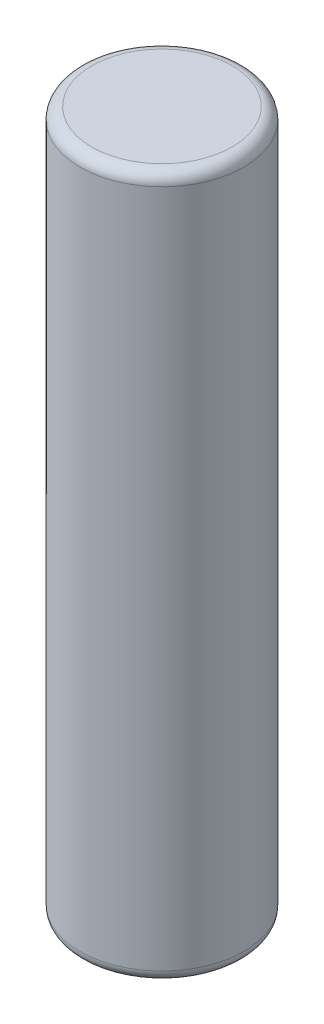
ISO-10303-21;
HEADER;
FILE_DESCRIPTION(('STEP AP214'),'2;1');
FILE_NAME('part.step','',(''),(''),'','','');
FILE_SCHEMA(('AUTOMOTIVE_DESIGN { 1 0 10303 214 1 1 1 1 }'));
ENDSEC;
DATA;
#1=APPLICATION_CONTEXT('core data for automotive mechanical design processes');
#2=APPLICATION_PROTOCOL_DEFINITION('international standard','automotive_design',2000,#1);
#3=PRODUCT_CONTEXT('',#1,'mechanical');
#4=PRODUCT('Part','Part','',(#3));
#5=PRODUCT_RELATED_PRODUCT_CATEGORY('part','',(#4));
#6=PRODUCT_DEFINITION_FORMATION('','',#4);
#7=PRODUCT_DEFINITION_CONTEXT('part definition',#1,'design');
#8=PRODUCT_DEFINITION('design','',#6,#7);
#9=PRODUCT_DEFINITION_SHAPE('','',#8);
#10=(LENGTH_UNIT() NAMED_UNIT(*) SI_UNIT(.MILLI.,.METRE.));
#11=(NAMED_UNIT(*) PLANE_ANGLE_UNIT() SI_UNIT($,.RADIAN.));
#12=(NAMED_UNIT(*) SI_UNIT($,.STERADIAN.) SOLID_ANGLE_UNIT());
#13=UNCERTAINTY_MEASURE_WITH_UNIT(LENGTH_MEASURE(1.E-05),#10,'distance_accuracy_value','');
#14=(GEOMETRIC_REPRESENTATION_CONTEXT(3) GLOBAL_UNCERTAINTY_ASSIGNED_CONTEXT((#13)) GLOBAL_UNIT_ASSIGNED_CONTEXT((#10,
#11,#12)) REPRESENTATION_CONTEXT('',''));
#15=CARTESIAN_POINT('',(0.,0.,0.));
#16=DIRECTION('',(0.,0.,1.));
#17=DIRECTION('',(1.,0.,0.));
#18=AXIS2_PLACEMENT_3D('',#15,#16,#17);
#19=CARTESIAN_POINT('',(0.,60.,0.));
#20=DIRECTION('',(0.,-1.,0.));
#21=DIRECTION('',(0.,0.,-1.));
#22=AXIS2_PLACEMENT_3D('',#19,#20,#21);
#23=CYLINDRICAL_SURFACE('',#22,7.00000000000001);
#24=CARTESIAN_POINT('',(0.,59.,0.));
#25=DIRECTION('',(0.,1.,0.));
#26=DIRECTION('',(0.,0.,1.));
#27=AXIS2_PLACEMENT_3D('',#24,#25,#26);
#28=CIRCLE('',#27,7.00000000000001);
#29=CARTESIAN_POINT('',(0.,59.,7.00000000000001));
#30=VERTEX_POINT('',#29);
#31=EDGE_CURVE('E45',#30,#30,#28,.F.);
#32=ORIENTED_EDGE('',*,*,#31,.T.);
#33=EDGE_LOOP('',(#32));
#34=FACE_BOUND('',#33,.T.);
#35=CARTESIAN_POINT('',(0.,1.,0.));
#36=DIRECTION('',(0.,1.,0.));
#37=DIRECTION('',(0.,0.,1.));
#38=AXIS2_PLACEMENT_3D('',#35,#36,#37);
#39=CIRCLE('',#38,7.00000000000001);
#40=CARTESIAN_POINT('',(0.,1.,7.00000000000001));
#41=VERTEX_POINT('',#40);
#42=EDGE_CURVE('E50',#41,#41,#39,.T.);
#43=ORIENTED_EDGE('',*,*,#42,.T.);
#44=EDGE_LOOP('',(#43));
#45=FACE_BOUND('',#44,.T.);
#46=ADVANCED_FACE('F37',(#34,#45),#23,.T.);
#47=CARTESIAN_POINT('',(0.,60.,0.));
#48=DIRECTION('',(0.,1.,0.));
#49=DIRECTION('',(0.,0.,1.));
#50=AXIS2_PLACEMENT_3D('',#47,#48,#49);
#51=PLANE('',#50);
#52=CARTESIAN_POINT('',(0.,60.,0.));
#53=DIRECTION('',(0.,1.,0.));
#54=DIRECTION('',(0.,0.,1.));
#55=AXIS2_PLACEMENT_3D('',#52,#53,#54);
#56=CIRCLE('',#55,6.00000000000001);
#57=CARTESIAN_POINT('',(0.,60.,6.00000000000001));
#58=VERTEX_POINT('',#57);
#59=EDGE_CURVE('E55',#58,#58,#56,.T.);
#60=ORIENTED_EDGE('',*,*,#59,.T.);
#61=EDGE_LOOP('',(#60));
#62=FACE_BOUND('',#61,.T.);
#63=ADVANCED_FACE('F62',(#62),#51,.T.);
#64=CARTESIAN_POINT('',(0.,0.,0.));
#65=DIRECTION('',(0.,1.,0.));
#66=DIRECTION('',(0.,0.,1.));
#67=AXIS2_PLACEMENT_3D('',#64,#65,#66);
#68=PLANE('',#67);
#69=CARTESIAN_POINT('',(0.,0.,0.));
#70=DIRECTION('',(0.,1.,0.));
#71=DIRECTION('',(0.,0.,1.));
#72=AXIS2_PLACEMENT_3D('',#69,#70,#71);
#73=CIRCLE('',#72,6.00000000000001);
#74=CARTESIAN_POINT('',(0.,0.,6.00000000000001));
#75=VERTEX_POINT('',#74);
#76=EDGE_CURVE('E10',#75,#75,#73,.F.);
#77=ORIENTED_EDGE('',*,*,#76,.T.);
#78=EDGE_LOOP('',(#77));
#79=FACE_BOUND('',#78,.T.);
#80=ADVANCED_FACE('F66',(#79),#68,.F.);
#81=CARTESIAN_POINT('',(0.,59.,0.));
#82=DIRECTION('',(0.,1.,0.));
#83=DIRECTION('',(0.,0.,1.));
#84=AXIS2_PLACEMENT_3D('',#81,#82,#83);
#85=TOROIDAL_SURFACE('',#84,6.00000000000001,1.);
#86=ORIENTED_EDGE('',*,*,#31,.F.);
#87=EDGE_LOOP('',(#86));
#88=FACE_BOUND('',#87,.T.);
#89=ORIENTED_EDGE('',*,*,#59,.F.);
#90=EDGE_LOOP('',(#89));
#91=FACE_BOUND('',#90,.T.);
#92=ADVANCED_FACE('F64',(#88,#91),#85,.T.);
#93=CARTESIAN_POINT('',(0.,1.,0.));
#94=DIRECTION('',(0.,1.,0.));
#95=DIRECTION('',(0.,0.,1.));
#96=AXIS2_PLACEMENT_3D('',#93,#94,#95);
#97=TOROIDAL_SURFACE('',#96,6.00000000000001,1.);
#98=ORIENTED_EDGE('',*,*,#76,.F.);
#99=EDGE_LOOP('',(#98));
#100=FACE_BOUND('',#99,.T.);
#101=ORIENTED_EDGE('',*,*,#42,.F.);
#102=EDGE_LOOP('',(#101));
#103=FACE_BOUND('',#102,.T.);
#104=ADVANCED_FACE('F39',(#100,#103),#97,.T.);
#105=CLOSED_SHELL('',(#46,#63,#80,#92,#104));
#106=MANIFOLD_SOLID_BREP('B2',#105);
#107=ADVANCED_BREP_SHAPE_REPRESENTATION('',(#18,#106),#14);
#108=SHAPE_DEFINITION_REPRESENTATION(#9,#107);
ENDSEC;
END-ISO-10303-21;
